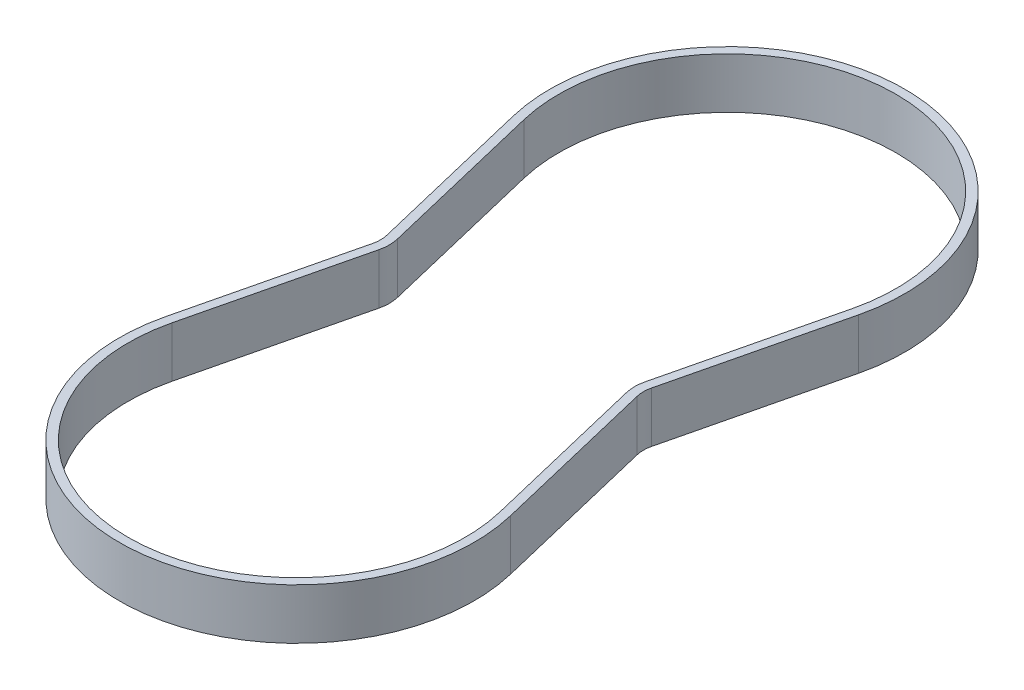
ISO-10303-21;
HEADER;
FILE_DESCRIPTION(('STEP AP214'),'2;1');
FILE_NAME('part.step','',(''),(''),'','','');
FILE_SCHEMA(('AUTOMOTIVE_DESIGN { 1 0 10303 214 1 1 1 1 }'));
ENDSEC;
DATA;
#1=APPLICATION_CONTEXT('core data for automotive mechanical design processes');
#2=APPLICATION_PROTOCOL_DEFINITION('international standard','automotive_design',2000,#1);
#3=PRODUCT_CONTEXT('',#1,'mechanical');
#4=PRODUCT('Part','Part','',(#3));
#5=PRODUCT_RELATED_PRODUCT_CATEGORY('part','',(#4));
#6=PRODUCT_DEFINITION_FORMATION('','',#4);
#7=PRODUCT_DEFINITION_CONTEXT('part definition',#1,'design');
#8=PRODUCT_DEFINITION('design','',#6,#7);
#9=PRODUCT_DEFINITION_SHAPE('','',#8);
#10=(LENGTH_UNIT() NAMED_UNIT(*) SI_UNIT(.MILLI.,.METRE.));
#11=(NAMED_UNIT(*) PLANE_ANGLE_UNIT() SI_UNIT($,.RADIAN.));
#12=(NAMED_UNIT(*) SI_UNIT($,.STERADIAN.) SOLID_ANGLE_UNIT());
#13=UNCERTAINTY_MEASURE_WITH_UNIT(LENGTH_MEASURE(1.E-05),#10,'distance_accuracy_value','');
#14=(GEOMETRIC_REPRESENTATION_CONTEXT(3) GLOBAL_UNCERTAINTY_ASSIGNED_CONTEXT((#13)) GLOBAL_UNIT_ASSIGNED_CONTEXT((#10,
#11,#12)) REPRESENTATION_CONTEXT('',''));
#15=CARTESIAN_POINT('',(0.,0.,0.));
#16=DIRECTION('',(0.,0.,1.));
#17=DIRECTION('',(1.,0.,0.));
#18=AXIS2_PLACEMENT_3D('',#15,#16,#17);
#19=CARTESIAN_POINT('',(0.,10.,-42.5));
#20=DIRECTION('',(0.,1.,0.));
#21=DIRECTION('',(0.,0.,1.));
#22=AXIS2_PLACEMENT_3D('',#19,#20,#21);
#23=PLANE('',#22);
#24=CARTESIAN_POINT('',(0.,10.,-42.5));
#25=DIRECTION('',(0.,1.,0.));
#26=DIRECTION('',(0.,0.,1.));
#27=AXIS2_PLACEMENT_3D('',#24,#25,#26);
#28=CIRCLE('',#27,35.);
#29=CARTESIAN_POINT('',(34.0290303937474,10.,-34.3131147277238));
#30=VERTEX_POINT('',#29);
#31=CARTESIAN_POINT('',(-34.0290303937474,10.,-34.3131147277238));
#32=VERTEX_POINT('',#31);
#33=EDGE_CURVE('E217',#30,#32,#28,.T.);
#34=ORIENTED_EDGE('',*,*,#33,.T.);
#35=DIRECTION('',(0.233911007779319,0.,0.972258011249927));
#36=VECTOR('',#35,1.);
#37=CARTESIAN_POINT('',(-34.0290303937474,10.,-34.3131147277238));
#38=LINE('',#37,#36);
#39=CARTESIAN_POINT('',(-26.1114519325004,10.,-1.40346604667591));
#40=VERTEX_POINT('',#39);
#41=EDGE_CURVE('E220',#32,#40,#38,.T.);
#42=ORIENTED_EDGE('',*,*,#41,.T.);
#43=CARTESIAN_POINT('',(-31.945,10.,0.));
#44=DIRECTION('',(0.,-1.,0.));
#45=DIRECTION('',(0.,0.,1.));
#46=AXIS2_PLACEMENT_3D('',#43,#44,#45);
#47=CIRCLE('',#46,5.99999999999999);
#48=CARTESIAN_POINT('',(-26.1114519325004,10.,1.40346604667592));
#49=VERTEX_POINT('',#48);
#50=EDGE_CURVE('E223',#40,#49,#47,.T.);
#51=ORIENTED_EDGE('',*,*,#50,.T.);
#52=DIRECTION('',(-0.233911007779319,0.,0.972258011249927));
#53=VECTOR('',#52,1.);
#54=CARTESIAN_POINT('',(-26.1114519325004,10.,1.40346604667592));
#55=LINE('',#54,#53);
#56=CARTESIAN_POINT('',(-34.0290303937474,10.,34.3131147277238));
#57=VERTEX_POINT('',#56);
#58=EDGE_CURVE('E225',#49,#57,#55,.T.);
#59=ORIENTED_EDGE('',*,*,#58,.T.);
#60=CARTESIAN_POINT('',(0.,10.,42.5));
#61=DIRECTION('',(0.,1.,0.));
#62=DIRECTION('',(0.,0.,1.));
#63=AXIS2_PLACEMENT_3D('',#60,#61,#62);
#64=CIRCLE('',#63,35.);
#65=CARTESIAN_POINT('',(34.0290303937474,10.,34.3131147277238));
#66=VERTEX_POINT('',#65);
#67=EDGE_CURVE('E227',#57,#66,#64,.T.);
#68=ORIENTED_EDGE('',*,*,#67,.T.);
#69=DIRECTION('',(-0.233911007779319,0.,-0.972258011249927));
#70=VECTOR('',#69,1.);
#71=CARTESIAN_POINT('',(34.0290303937474,10.,34.3131147277238));
#72=LINE('',#71,#70);
#73=CARTESIAN_POINT('',(26.1114519325004,10.,1.40346604667592));
#74=VERTEX_POINT('',#73);
#75=EDGE_CURVE('E229',#66,#74,#72,.T.);
#76=ORIENTED_EDGE('',*,*,#75,.T.);
#77=CARTESIAN_POINT('',(31.945,10.,0.));
#78=DIRECTION('',(0.,-1.,0.));
#79=DIRECTION('',(0.,0.,1.));
#80=AXIS2_PLACEMENT_3D('',#77,#78,#79);
#81=CIRCLE('',#80,5.99999999999999);
#82=CARTESIAN_POINT('',(26.1114519325004,10.,-1.40346604667592));
#83=VERTEX_POINT('',#82);
#84=EDGE_CURVE('E231',#74,#83,#81,.T.);
#85=ORIENTED_EDGE('',*,*,#84,.T.);
#86=DIRECTION('',(0.233911007779319,0.,-0.972258011249927));
#87=VECTOR('',#86,1.);
#88=CARTESIAN_POINT('',(34.0290303937474,10.,-34.3131147277238));
#89=LINE('',#88,#87);
#90=EDGE_CURVE('E233',#83,#30,#89,.T.);
#91=ORIENTED_EDGE('',*,*,#90,.T.);
#92=EDGE_LOOP('',(#34,#42,#51,#59,#68,#76,#85,#91));
#93=FACE_BOUND('',#92,.T.);
#94=DIRECTION('',(0.233911007779319,0.,-0.972258011249927));
#95=VECTOR('',#94,1.);
#96=CARTESIAN_POINT('',(24.4197229929256,10.,-1.81047120021193));
#97=LINE('',#96,#95);
#98=CARTESIAN_POINT('',(24.4197229929256,10.,-1.81047120021193));
#99=VERTEX_POINT('',#98);
#100=CARTESIAN_POINT('',(32.3373014541726,10.,-34.7201198812598));
#101=VERTEX_POINT('',#100);
#102=EDGE_CURVE('E160',#99,#101,#97,.T.);
#103=ORIENTED_EDGE('',*,*,#102,.F.);
#104=CARTESIAN_POINT('',(31.945,10.,0.));
#105=DIRECTION('',(0.,-1.,0.));
#106=DIRECTION('',(0.,0.,1.));
#107=AXIS2_PLACEMENT_3D('',#104,#105,#106);
#108=CIRCLE('',#107,7.73999999999999);
#109=CARTESIAN_POINT('',(24.4197229929256,10.,1.81047120021193));
#110=VERTEX_POINT('',#109);
#111=EDGE_CURVE('E152',#110,#99,#108,.T.);
#112=ORIENTED_EDGE('',*,*,#111,.F.);
#113=DIRECTION('',(-0.233911007779319,0.,-0.972258011249927));
#114=VECTOR('',#113,1.);
#115=CARTESIAN_POINT('',(32.3373014541726,10.,34.7201198812598));
#116=LINE('',#115,#114);
#117=CARTESIAN_POINT('',(32.3373014541726,10.,34.7201198812599));
#118=VERTEX_POINT('',#117);
#119=EDGE_CURVE('E185',#118,#110,#116,.T.);
#120=ORIENTED_EDGE('',*,*,#119,.F.);
#121=CARTESIAN_POINT('',(0.,10.,42.5));
#122=DIRECTION('',(0.,1.,0.));
#123=DIRECTION('',(0.,0.,1.));
#124=AXIS2_PLACEMENT_3D('',#121,#122,#123);
#125=CIRCLE('',#124,33.26);
#126=CARTESIAN_POINT('',(-32.3373014541726,10.,34.7201198812598));
#127=VERTEX_POINT('',#126);
#128=EDGE_CURVE('E183',#127,#118,#125,.T.);
#129=ORIENTED_EDGE('',*,*,#128,.F.);
#130=DIRECTION('',(-0.233911007779319,0.,0.972258011249927));
#131=VECTOR('',#130,1.);
#132=CARTESIAN_POINT('',(-24.4197229929256,10.,1.81047120021193));
#133=LINE('',#132,#131);
#134=CARTESIAN_POINT('',(-24.4197229929256,10.,1.81047120021193));
#135=VERTEX_POINT('',#134);
#136=EDGE_CURVE('E181',#135,#127,#133,.T.);
#137=ORIENTED_EDGE('',*,*,#136,.F.);
#138=CARTESIAN_POINT('',(-31.945,10.,0.));
#139=DIRECTION('',(0.,-1.,0.));
#140=DIRECTION('',(0.,0.,1.));
#141=AXIS2_PLACEMENT_3D('',#138,#139,#140);
#142=CIRCLE('',#141,7.73999999999998);
#143=CARTESIAN_POINT('',(-24.4197229929256,10.,-1.81047120021193));
#144=VERTEX_POINT('',#143);
#145=EDGE_CURVE('E179',#144,#135,#142,.T.);
#146=ORIENTED_EDGE('',*,*,#145,.F.);
#147=DIRECTION('',(0.233911007779319,0.,0.972258011249927));
#148=VECTOR('',#147,1.);
#149=CARTESIAN_POINT('',(-32.3373014541726,10.,-34.7201198812598));
#150=LINE('',#149,#148);
#151=CARTESIAN_POINT('',(-32.3373014541726,10.,-34.7201198812598));
#152=VERTEX_POINT('',#151);
#153=EDGE_CURVE('E175',#152,#144,#150,.T.);
#154=ORIENTED_EDGE('',*,*,#153,.F.);
#155=CARTESIAN_POINT('',(0.,10.,-42.5));
#156=DIRECTION('',(0.,1.,0.));
#157=DIRECTION('',(0.,0.,1.));
#158=AXIS2_PLACEMENT_3D('',#155,#156,#157);
#159=CIRCLE('',#158,33.26);
#160=EDGE_CURVE('E173',#101,#152,#159,.T.);
#161=ORIENTED_EDGE('',*,*,#160,.F.);
#162=EDGE_LOOP('',(#103,#112,#120,#129,#137,#146,#154,#161));
#163=FACE_BOUND('',#162,.T.);
#164=ADVANCED_FACE('F39',(#93,#163),#23,.T.);
#165=CARTESIAN_POINT('',(0.,0.,-42.5));
#166=DIRECTION('',(0.,1.,0.));
#167=DIRECTION('',(0.,0.,1.));
#168=AXIS2_PLACEMENT_3D('',#165,#166,#167);
#169=PLANE('',#168);
#170=CARTESIAN_POINT('',(0.,0.,-42.5));
#171=DIRECTION('',(0.,1.,0.));
#172=DIRECTION('',(0.,0.,1.));
#173=AXIS2_PLACEMENT_3D('',#170,#171,#172);
#174=CIRCLE('',#173,35.);
#175=CARTESIAN_POINT('',(34.0290303937474,0.,-34.3131147277238));
#176=VERTEX_POINT('',#175);
#177=CARTESIAN_POINT('',(-34.0290303937474,0.,-34.3131147277238));
#178=VERTEX_POINT('',#177);
#179=EDGE_CURVE('E168',#176,#178,#174,.T.);
#180=ORIENTED_EDGE('',*,*,#179,.F.);
#181=DIRECTION('',(0.233911007779319,0.,-0.972258011249927));
#182=VECTOR('',#181,1.);
#183=CARTESIAN_POINT('',(34.0290303937474,0.,-34.3131147277238));
#184=LINE('',#183,#182);
#185=CARTESIAN_POINT('',(26.1114519325004,0.,-1.40346604667592));
#186=VERTEX_POINT('',#185);
#187=EDGE_CURVE('E221',#186,#176,#184,.T.);
#188=ORIENTED_EDGE('',*,*,#187,.F.);
#189=CARTESIAN_POINT('',(31.945,0.,0.));
#190=DIRECTION('',(0.,-1.,0.));
#191=DIRECTION('',(0.,0.,1.));
#192=AXIS2_PLACEMENT_3D('',#189,#190,#191);
#193=CIRCLE('',#192,5.99999999999999);
#194=CARTESIAN_POINT('',(26.1114519325004,0.,1.40346604667592));
#195=VERTEX_POINT('',#194);
#196=EDGE_CURVE('E248',#195,#186,#193,.T.);
#197=ORIENTED_EDGE('',*,*,#196,.F.);
#198=DIRECTION('',(-0.233911007779319,0.,-0.972258011249927));
#199=VECTOR('',#198,1.);
#200=CARTESIAN_POINT('',(34.0290303937474,0.,34.3131147277238));
#201=LINE('',#200,#199);
#202=CARTESIAN_POINT('',(34.0290303937474,0.,34.3131147277238));
#203=VERTEX_POINT('',#202);
#204=EDGE_CURVE('E246',#203,#195,#201,.T.);
#205=ORIENTED_EDGE('',*,*,#204,.F.);
#206=CARTESIAN_POINT('',(0.,0.,42.5));
#207=DIRECTION('',(0.,1.,0.));
#208=DIRECTION('',(0.,0.,1.));
#209=AXIS2_PLACEMENT_3D('',#206,#207,#208);
#210=CIRCLE('',#209,35.);
#211=CARTESIAN_POINT('',(-34.0290303937474,0.,34.3131147277238));
#212=VERTEX_POINT('',#211);
#213=EDGE_CURVE('E244',#212,#203,#210,.T.);
#214=ORIENTED_EDGE('',*,*,#213,.F.);
#215=DIRECTION('',(-0.233911007779319,0.,0.972258011249927));
#216=VECTOR('',#215,1.);
#217=CARTESIAN_POINT('',(-26.1114519325004,0.,1.40346604667592));
#218=LINE('',#217,#216);
#219=CARTESIAN_POINT('',(-26.1114519325004,0.,1.40346604667592));
#220=VERTEX_POINT('',#219);
#221=EDGE_CURVE('E242',#220,#212,#218,.T.);
#222=ORIENTED_EDGE('',*,*,#221,.F.);
#223=CARTESIAN_POINT('',(-31.945,0.,0.));
#224=DIRECTION('',(0.,-1.,0.));
#225=DIRECTION('',(0.,0.,1.));
#226=AXIS2_PLACEMENT_3D('',#223,#224,#225);
#227=CIRCLE('',#226,5.99999999999999);
#228=CARTESIAN_POINT('',(-26.1114519325004,0.,-1.40346604667591));
#229=VERTEX_POINT('',#228);
#230=EDGE_CURVE('E240',#229,#220,#227,.T.);
#231=ORIENTED_EDGE('',*,*,#230,.F.);
#232=DIRECTION('',(0.233911007779319,0.,0.972258011249927));
#233=VECTOR('',#232,1.);
#234=CARTESIAN_POINT('',(-34.0290303937474,0.,-34.3131147277238));
#235=LINE('',#234,#233);
#236=EDGE_CURVE('E238',#178,#229,#235,.T.);
#237=ORIENTED_EDGE('',*,*,#236,.F.);
#238=EDGE_LOOP('',(#180,#188,#197,#205,#214,#222,#231,#237));
#239=FACE_BOUND('',#238,.T.);
#240=CARTESIAN_POINT('',(31.945,0.,0.));
#241=DIRECTION('',(0.,-1.,0.));
#242=DIRECTION('',(0.,0.,1.));
#243=AXIS2_PLACEMENT_3D('',#240,#241,#242);
#244=CIRCLE('',#243,7.73999999999999);
#245=CARTESIAN_POINT('',(24.4197229929256,0.,1.81047120021193));
#246=VERTEX_POINT('',#245);
#247=CARTESIAN_POINT('',(24.4197229929256,0.,-1.81047120021193));
#248=VERTEX_POINT('',#247);
#249=EDGE_CURVE('E62',#246,#248,#244,.T.);
#250=ORIENTED_EDGE('',*,*,#249,.T.);
#251=DIRECTION('',(0.233911007779319,0.,-0.972258011249927));
#252=VECTOR('',#251,1.);
#253=CARTESIAN_POINT('',(24.4197229929256,0.,-1.81047120021193));
#254=LINE('',#253,#252);
#255=CARTESIAN_POINT('',(32.3373014541726,0.,-34.7201198812598));
#256=VERTEX_POINT('',#255);
#257=EDGE_CURVE('E167',#248,#256,#254,.T.);
#258=ORIENTED_EDGE('',*,*,#257,.T.);
#259=CARTESIAN_POINT('',(0.,0.,-42.5));
#260=DIRECTION('',(0.,1.,0.));
#261=DIRECTION('',(0.,0.,1.));
#262=AXIS2_PLACEMENT_3D('',#259,#260,#261);
#263=CIRCLE('',#262,33.26);
#264=CARTESIAN_POINT('',(-32.3373014541726,0.,-34.7201198812598));
#265=VERTEX_POINT('',#264);
#266=EDGE_CURVE('E189',#256,#265,#263,.T.);
#267=ORIENTED_EDGE('',*,*,#266,.T.);
#268=DIRECTION('',(0.233911007779319,0.,0.972258011249927));
#269=VECTOR('',#268,1.);
#270=CARTESIAN_POINT('',(-32.3373014541726,0.,-34.7201198812598));
#271=LINE('',#270,#269);
#272=CARTESIAN_POINT('',(-24.4197229929256,0.,-1.81047120021193));
#273=VERTEX_POINT('',#272);
#274=EDGE_CURVE('E192',#265,#273,#271,.T.);
#275=ORIENTED_EDGE('',*,*,#274,.T.);
#276=CARTESIAN_POINT('',(-31.945,0.,0.));
#277=DIRECTION('',(0.,-1.,0.));
#278=DIRECTION('',(0.,0.,1.));
#279=AXIS2_PLACEMENT_3D('',#276,#277,#278);
#280=CIRCLE('',#279,7.73999999999998);
#281=CARTESIAN_POINT('',(-24.4197229929256,0.,1.81047120021193));
#282=VERTEX_POINT('',#281);
#283=EDGE_CURVE('E195',#273,#282,#280,.T.);
#284=ORIENTED_EDGE('',*,*,#283,.T.);
#285=DIRECTION('',(-0.233911007779319,0.,0.972258011249927));
#286=VECTOR('',#285,1.);
#287=CARTESIAN_POINT('',(-24.4197229929256,0.,1.81047120021193));
#288=LINE('',#287,#286);
#289=CARTESIAN_POINT('',(-32.3373014541726,0.,34.7201198812598));
#290=VERTEX_POINT('',#289);
#291=EDGE_CURVE('E198',#282,#290,#288,.T.);
#292=ORIENTED_EDGE('',*,*,#291,.T.);
#293=CARTESIAN_POINT('',(0.,0.,42.5));
#294=DIRECTION('',(0.,1.,0.));
#295=DIRECTION('',(0.,0.,1.));
#296=AXIS2_PLACEMENT_3D('',#293,#294,#295);
#297=CIRCLE('',#296,33.26);
#298=CARTESIAN_POINT('',(32.3373014541726,0.,34.7201198812599));
#299=VERTEX_POINT('',#298);
#300=EDGE_CURVE('E201',#290,#299,#297,.T.);
#301=ORIENTED_EDGE('',*,*,#300,.T.);
#302=DIRECTION('',(-0.233911007779319,0.,-0.972258011249927));
#303=VECTOR('',#302,1.);
#304=CARTESIAN_POINT('',(32.3373014541726,0.,34.7201198812598));
#305=LINE('',#304,#303);
#306=EDGE_CURVE('E161',#299,#246,#305,.T.);
#307=ORIENTED_EDGE('',*,*,#306,.T.);
#308=EDGE_LOOP('',(#250,#258,#267,#275,#284,#292,#301,#307));
#309=FACE_BOUND('',#308,.T.);
#310=ADVANCED_FACE('F278',(#239,#309),#169,.F.);
#311=CARTESIAN_POINT('',(0.,10.,-42.5));
#312=DIRECTION('',(0.,-1.,0.));
#313=DIRECTION('',(0.,0.,-1.));
#314=AXIS2_PLACEMENT_3D('',#311,#312,#313);
#315=CYLINDRICAL_SURFACE('',#314,35.);
#316=ORIENTED_EDGE('',*,*,#179,.T.);
#317=DIRECTION('',(0.,-1.,0.));
#318=VECTOR('',#317,1.);
#319=CARTESIAN_POINT('',(-34.0290303937474,10.,-34.3131147277238));
#320=LINE('',#319,#318);
#321=EDGE_CURVE('E11',#32,#178,#320,.T.);
#322=ORIENTED_EDGE('',*,*,#321,.F.);
#323=ORIENTED_EDGE('',*,*,#33,.F.);
#324=DIRECTION('',(0.,-1.,0.));
#325=VECTOR('',#324,1.);
#326=CARTESIAN_POINT('',(34.0290303937474,10.,-34.3131147277238));
#327=LINE('',#326,#325);
#328=EDGE_CURVE('E235',#30,#176,#327,.T.);
#329=ORIENTED_EDGE('',*,*,#328,.T.);
#330=EDGE_LOOP('',(#316,#322,#323,#329));
#331=FACE_BOUND('',#330,.T.);
#332=ADVANCED_FACE('F41',(#331),#315,.T.);
#333=CARTESIAN_POINT('',(-34.0290303937474,10.,-34.3131147277238));
#334=DIRECTION('',(0.972258011249927,0.,-0.233911007779319));
#335=DIRECTION('',(-0.233911007779319,0.,-0.972258011249927));
#336=AXIS2_PLACEMENT_3D('',#333,#334,#335);
#337=PLANE('',#336);
#338=ORIENTED_EDGE('',*,*,#236,.T.);
#339=DIRECTION('',(0.,-1.,0.));
#340=VECTOR('',#339,1.);
#341=CARTESIAN_POINT('',(-26.1114519325004,10.,-1.40346604667591));
#342=LINE('',#341,#340);
#343=EDGE_CURVE('E47',#40,#229,#342,.T.);
#344=ORIENTED_EDGE('',*,*,#343,.F.);
#345=ORIENTED_EDGE('',*,*,#41,.F.);
#346=ORIENTED_EDGE('',*,*,#321,.T.);
#347=EDGE_LOOP('',(#338,#344,#345,#346));
#348=FACE_BOUND('',#347,.T.);
#349=ADVANCED_FACE('F295',(#348),#337,.F.);
#350=CARTESIAN_POINT('',(-31.945,10.,0.));
#351=DIRECTION('',(0.,-1.,0.));
#352=DIRECTION('',(0.,0.,-1.));
#353=AXIS2_PLACEMENT_3D('',#350,#351,#352);
#354=CYLINDRICAL_SURFACE('',#353,5.99999999999999);
#355=ORIENTED_EDGE('',*,*,#230,.T.);
#356=DIRECTION('',(0.,-1.,0.));
#357=VECTOR('',#356,1.);
#358=CARTESIAN_POINT('',(-26.1114519325004,10.,1.40346604667592));
#359=LINE('',#358,#357);
#360=EDGE_CURVE('E265',#49,#220,#359,.T.);
#361=ORIENTED_EDGE('',*,*,#360,.F.);
#362=ORIENTED_EDGE('',*,*,#50,.F.);
#363=ORIENTED_EDGE('',*,*,#343,.T.);
#364=EDGE_LOOP('',(#355,#361,#362,#363));
#365=FACE_BOUND('',#364,.T.);
#366=ADVANCED_FACE('F272',(#365),#354,.F.);
#367=CARTESIAN_POINT('',(-26.1114519325004,10.,1.40346604667592));
#368=DIRECTION('',(0.972258011249927,0.,0.233911007779319));
#369=DIRECTION('',(0.233911007779319,0.,-0.972258011249927));
#370=AXIS2_PLACEMENT_3D('',#367,#368,#369);
#371=PLANE('',#370);
#372=ORIENTED_EDGE('',*,*,#221,.T.);
#373=DIRECTION('',(0.,-1.,0.));
#374=VECTOR('',#373,1.);
#375=CARTESIAN_POINT('',(-34.0290303937474,10.,34.3131147277238));
#376=LINE('',#375,#374);
#377=EDGE_CURVE('E262',#57,#212,#376,.T.);
#378=ORIENTED_EDGE('',*,*,#377,.F.);
#379=ORIENTED_EDGE('',*,*,#58,.F.);
#380=ORIENTED_EDGE('',*,*,#360,.T.);
#381=EDGE_LOOP('',(#372,#378,#379,#380));
#382=FACE_BOUND('',#381,.T.);
#383=ADVANCED_FACE('F284',(#382),#371,.F.);
#384=CARTESIAN_POINT('',(0.,10.,42.5));
#385=DIRECTION('',(0.,-1.,0.));
#386=DIRECTION('',(0.,0.,-1.));
#387=AXIS2_PLACEMENT_3D('',#384,#385,#386);
#388=CYLINDRICAL_SURFACE('',#387,35.);
#389=ORIENTED_EDGE('',*,*,#213,.T.);
#390=DIRECTION('',(0.,-1.,0.));
#391=VECTOR('',#390,1.);
#392=CARTESIAN_POINT('',(34.0290303937474,10.,34.3131147277238));
#393=LINE('',#392,#391);
#394=EDGE_CURVE('E259',#66,#203,#393,.T.);
#395=ORIENTED_EDGE('',*,*,#394,.F.);
#396=ORIENTED_EDGE('',*,*,#67,.F.);
#397=ORIENTED_EDGE('',*,*,#377,.T.);
#398=EDGE_LOOP('',(#389,#395,#396,#397));
#399=FACE_BOUND('',#398,.T.);
#400=ADVANCED_FACE('F288',(#399),#388,.T.);
#401=CARTESIAN_POINT('',(34.0290303937474,10.,34.3131147277238));
#402=DIRECTION('',(-0.972258011249927,0.,0.233911007779319));
#403=DIRECTION('',(0.233911007779319,0.,0.972258011249927));
#404=AXIS2_PLACEMENT_3D('',#401,#402,#403);
#405=PLANE('',#404);
#406=ORIENTED_EDGE('',*,*,#204,.T.);
#407=DIRECTION('',(0.,-1.,0.));
#408=VECTOR('',#407,1.);
#409=CARTESIAN_POINT('',(26.1114519325004,10.,1.40346604667592));
#410=LINE('',#409,#408);
#411=EDGE_CURVE('E256',#74,#195,#410,.T.);
#412=ORIENTED_EDGE('',*,*,#411,.F.);
#413=ORIENTED_EDGE('',*,*,#75,.F.);
#414=ORIENTED_EDGE('',*,*,#394,.T.);
#415=EDGE_LOOP('',(#406,#412,#413,#414));
#416=FACE_BOUND('',#415,.T.);
#417=ADVANCED_FACE('F308',(#416),#405,.F.);
#418=CARTESIAN_POINT('',(31.945,10.,0.));
#419=DIRECTION('',(0.,-1.,0.));
#420=DIRECTION('',(0.,0.,-1.));
#421=AXIS2_PLACEMENT_3D('',#418,#419,#420);
#422=CYLINDRICAL_SURFACE('',#421,5.99999999999999);
#423=ORIENTED_EDGE('',*,*,#196,.T.);
#424=DIRECTION('',(0.,-1.,0.));
#425=VECTOR('',#424,1.);
#426=CARTESIAN_POINT('',(26.1114519325004,10.,-1.40346604667592));
#427=LINE('',#426,#425);
#428=EDGE_CURVE('E253',#83,#186,#427,.T.);
#429=ORIENTED_EDGE('',*,*,#428,.F.);
#430=ORIENTED_EDGE('',*,*,#84,.F.);
#431=ORIENTED_EDGE('',*,*,#411,.T.);
#432=EDGE_LOOP('',(#423,#429,#430,#431));
#433=FACE_BOUND('',#432,.T.);
#434=ADVANCED_FACE('F306',(#433),#422,.F.);
#435=CARTESIAN_POINT('',(34.0290303937474,10.,-34.3131147277238));
#436=DIRECTION('',(-0.972258011249927,0.,-0.233911007779319));
#437=DIRECTION('',(-0.233911007779319,0.,0.972258011249927));
#438=AXIS2_PLACEMENT_3D('',#435,#436,#437);
#439=PLANE('',#438);
#440=ORIENTED_EDGE('',*,*,#187,.T.);
#441=ORIENTED_EDGE('',*,*,#328,.F.);
#442=ORIENTED_EDGE('',*,*,#90,.F.);
#443=ORIENTED_EDGE('',*,*,#428,.T.);
#444=EDGE_LOOP('',(#440,#441,#442,#443));
#445=FACE_BOUND('',#444,.T.);
#446=ADVANCED_FACE('F301',(#445),#439,.F.);
#447=CARTESIAN_POINT('',(31.945,10.,0.));
#448=DIRECTION('',(0.,-1.,0.));
#449=DIRECTION('',(0.,0.,-1.));
#450=AXIS2_PLACEMENT_3D('',#447,#448,#449);
#451=CYLINDRICAL_SURFACE('',#450,7.73999999999999);
#452=ORIENTED_EDGE('',*,*,#249,.F.);
#453=DIRECTION('',(0.,-1.,0.));
#454=VECTOR('',#453,1.);
#455=CARTESIAN_POINT('',(24.4197229929256,10.,1.81047120021193));
#456=LINE('',#455,#454);
#457=EDGE_CURVE('E156',#110,#246,#456,.T.);
#458=ORIENTED_EDGE('',*,*,#457,.F.);
#459=ORIENTED_EDGE('',*,*,#111,.T.);
#460=DIRECTION('',(0.,-1.,0.));
#461=VECTOR('',#460,1.);
#462=CARTESIAN_POINT('',(24.4197229929256,10.,-1.81047120021193));
#463=LINE('',#462,#461);
#464=EDGE_CURVE('E155',#99,#248,#463,.T.);
#465=ORIENTED_EDGE('',*,*,#464,.T.);
#466=EDGE_LOOP('',(#452,#458,#459,#465));
#467=FACE_BOUND('',#466,.T.);
#468=ADVANCED_FACE('F154',(#467),#451,.T.);
#469=CARTESIAN_POINT('',(24.4197229929256,10.,-1.81047120021193));
#470=DIRECTION('',(-0.972258011249927,0.,-0.233911007779319));
#471=DIRECTION('',(-0.233911007779319,0.,0.972258011249927));
#472=AXIS2_PLACEMENT_3D('',#469,#470,#471);
#473=PLANE('',#472);
#474=ORIENTED_EDGE('',*,*,#257,.F.);
#475=ORIENTED_EDGE('',*,*,#464,.F.);
#476=ORIENTED_EDGE('',*,*,#102,.T.);
#477=DIRECTION('',(0.,-1.,0.));
#478=VECTOR('',#477,1.);
#479=CARTESIAN_POINT('',(32.3373014541726,10.,-34.7201198812598));
#480=LINE('',#479,#478);
#481=EDGE_CURVE('E169',#101,#256,#480,.T.);
#482=ORIENTED_EDGE('',*,*,#481,.T.);
#483=EDGE_LOOP('',(#474,#475,#476,#482));
#484=FACE_BOUND('',#483,.T.);
#485=ADVANCED_FACE('F164',(#484),#473,.T.);
#486=CARTESIAN_POINT('',(0.,10.,-42.5));
#487=DIRECTION('',(0.,-1.,0.));
#488=DIRECTION('',(0.,0.,-1.));
#489=AXIS2_PLACEMENT_3D('',#486,#487,#488);
#490=CYLINDRICAL_SURFACE('',#489,33.26);
#491=ORIENTED_EDGE('',*,*,#266,.F.);
#492=ORIENTED_EDGE('',*,*,#481,.F.);
#493=ORIENTED_EDGE('',*,*,#160,.T.);
#494=DIRECTION('',(0.,-1.,0.));
#495=VECTOR('',#494,1.);
#496=CARTESIAN_POINT('',(-32.3373014541726,10.,-34.7201198812598));
#497=LINE('',#496,#495);
#498=EDGE_CURVE('E214',#152,#265,#497,.T.);
#499=ORIENTED_EDGE('',*,*,#498,.T.);
#500=EDGE_LOOP('',(#491,#492,#493,#499));
#501=FACE_BOUND('',#500,.T.);
#502=ADVANCED_FACE('F333',(#501),#490,.F.);
#503=CARTESIAN_POINT('',(-32.3373014541726,10.,-34.7201198812598));
#504=DIRECTION('',(0.972258011249927,0.,-0.233911007779319));
#505=DIRECTION('',(-0.233911007779319,0.,-0.972258011249927));
#506=AXIS2_PLACEMENT_3D('',#503,#504,#505);
#507=PLANE('',#506);
#508=ORIENTED_EDGE('',*,*,#274,.F.);
#509=ORIENTED_EDGE('',*,*,#498,.F.);
#510=ORIENTED_EDGE('',*,*,#153,.T.);
#511=DIRECTION('',(0.,-1.,0.));
#512=VECTOR('',#511,1.);
#513=CARTESIAN_POINT('',(-24.4197229929256,10.,-1.81047120021193));
#514=LINE('',#513,#512);
#515=EDGE_CURVE('E212',#144,#273,#514,.T.);
#516=ORIENTED_EDGE('',*,*,#515,.T.);
#517=EDGE_LOOP('',(#508,#509,#510,#516));
#518=FACE_BOUND('',#517,.T.);
#519=ADVANCED_FACE('F337',(#518),#507,.T.);
#520=CARTESIAN_POINT('',(-31.945,10.,0.));
#521=DIRECTION('',(0.,-1.,0.));
#522=DIRECTION('',(0.,0.,-1.));
#523=AXIS2_PLACEMENT_3D('',#520,#521,#522);
#524=CYLINDRICAL_SURFACE('',#523,7.73999999999998);
#525=ORIENTED_EDGE('',*,*,#283,.F.);
#526=ORIENTED_EDGE('',*,*,#515,.F.);
#527=ORIENTED_EDGE('',*,*,#145,.T.);
#528=DIRECTION('',(0.,-1.,0.));
#529=VECTOR('',#528,1.);
#530=CARTESIAN_POINT('',(-24.4197229929256,10.,1.81047120021193));
#531=LINE('',#530,#529);
#532=EDGE_CURVE('E210',#135,#282,#531,.T.);
#533=ORIENTED_EDGE('',*,*,#532,.T.);
#534=EDGE_LOOP('',(#525,#526,#527,#533));
#535=FACE_BOUND('',#534,.T.);
#536=ADVANCED_FACE('F343',(#535),#524,.T.);
#537=CARTESIAN_POINT('',(-24.4197229929256,10.,1.81047120021193));
#538=DIRECTION('',(0.972258011249927,0.,0.233911007779319));
#539=DIRECTION('',(0.233911007779319,0.,-0.972258011249927));
#540=AXIS2_PLACEMENT_3D('',#537,#538,#539);
#541=PLANE('',#540);
#542=ORIENTED_EDGE('',*,*,#291,.F.);
#543=ORIENTED_EDGE('',*,*,#532,.F.);
#544=ORIENTED_EDGE('',*,*,#136,.T.);
#545=DIRECTION('',(0.,-1.,0.));
#546=VECTOR('',#545,1.);
#547=CARTESIAN_POINT('',(-32.3373014541726,10.,34.7201198812598));
#548=LINE('',#547,#546);
#549=EDGE_CURVE('E208',#127,#290,#548,.T.);
#550=ORIENTED_EDGE('',*,*,#549,.T.);
#551=EDGE_LOOP('',(#542,#543,#544,#550));
#552=FACE_BOUND('',#551,.T.);
#553=ADVANCED_FACE('F347',(#552),#541,.T.);
#554=CARTESIAN_POINT('',(0.,10.,42.5));
#555=DIRECTION('',(0.,-1.,0.));
#556=DIRECTION('',(0.,0.,-1.));
#557=AXIS2_PLACEMENT_3D('',#554,#555,#556);
#558=CYLINDRICAL_SURFACE('',#557,33.26);
#559=ORIENTED_EDGE('',*,*,#300,.F.);
#560=ORIENTED_EDGE('',*,*,#549,.F.);
#561=ORIENTED_EDGE('',*,*,#128,.T.);
#562=DIRECTION('',(0.,-1.,0.));
#563=VECTOR('',#562,1.);
#564=CARTESIAN_POINT('',(32.3373014541726,10.,34.7201198812599));
#565=LINE('',#564,#563);
#566=EDGE_CURVE('E54',#118,#299,#565,.T.);
#567=ORIENTED_EDGE('',*,*,#566,.T.);
#568=EDGE_LOOP('',(#559,#560,#561,#567));
#569=FACE_BOUND('',#568,.T.);
#570=ADVANCED_FACE('F351',(#569),#558,.F.);
#571=CARTESIAN_POINT('',(32.3373014541726,10.,34.7201198812598));
#572=DIRECTION('',(-0.972258011249927,0.,0.233911007779319));
#573=DIRECTION('',(0.233911007779319,0.,0.972258011249927));
#574=AXIS2_PLACEMENT_3D('',#571,#572,#573);
#575=PLANE('',#574);
#576=ORIENTED_EDGE('',*,*,#306,.F.);
#577=ORIENTED_EDGE('',*,*,#566,.F.);
#578=ORIENTED_EDGE('',*,*,#119,.T.);
#579=ORIENTED_EDGE('',*,*,#457,.T.);
#580=EDGE_LOOP('',(#576,#577,#578,#579));
#581=FACE_BOUND('',#580,.T.);
#582=ADVANCED_FACE('F355',(#581),#575,.T.);
#583=CLOSED_SHELL('',(#164,#310,#332,#349,#366,#383,#400,#417,#434,#446,#468,#485,#502,#519,
#536,#553,#570,#582));
#584=MANIFOLD_SOLID_BREP('B2',#583);
#585=ADVANCED_BREP_SHAPE_REPRESENTATION('',(#18,#584),#14);
#586=SHAPE_DEFINITION_REPRESENTATION(#9,#585);
ENDSEC;
END-ISO-10303-21;
